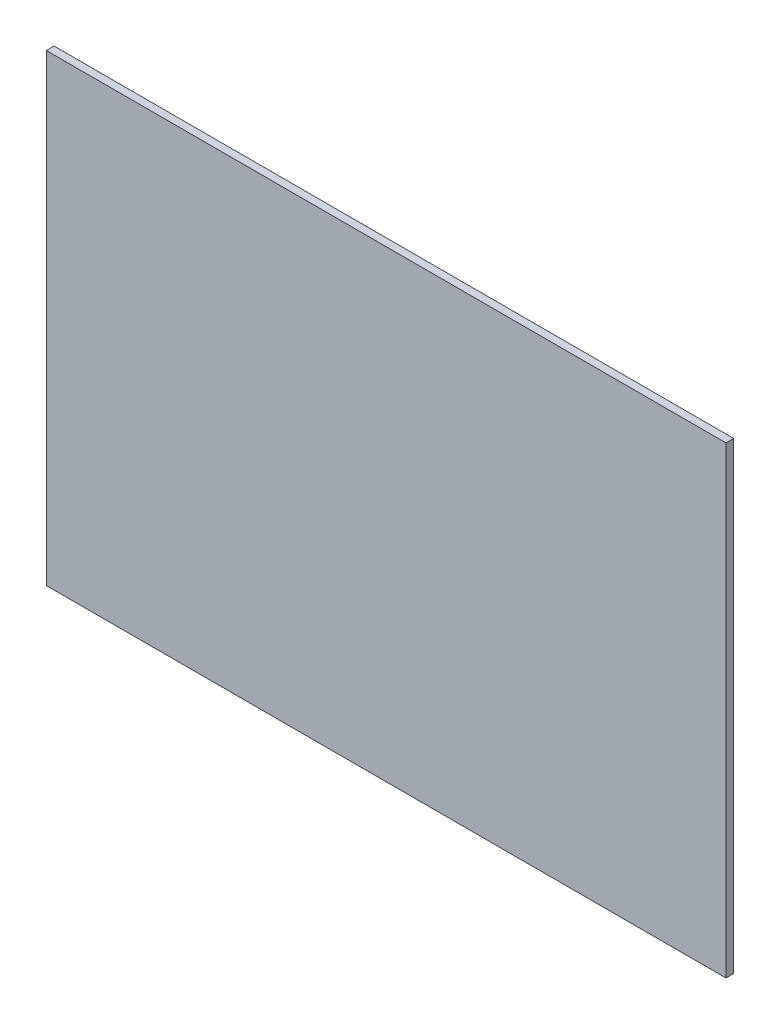
ISO-10303-21;
HEADER;
FILE_DESCRIPTION(('STEP AP214'),'2;1');
FILE_NAME('part.step','',(''),(''),'','','');
FILE_SCHEMA(('AUTOMOTIVE_DESIGN { 1 0 10303 214 1 1 1 1 }'));
ENDSEC;
DATA;
#1=APPLICATION_CONTEXT('core data for automotive mechanical design processes');
#2=APPLICATION_PROTOCOL_DEFINITION('international standard','automotive_design',2000,#1);
#3=PRODUCT_CONTEXT('',#1,'mechanical');
#4=PRODUCT('Part','Part','',(#3));
#5=PRODUCT_RELATED_PRODUCT_CATEGORY('part','',(#4));
#6=PRODUCT_DEFINITION_FORMATION('','',#4);
#7=PRODUCT_DEFINITION_CONTEXT('part definition',#1,'design');
#8=PRODUCT_DEFINITION('design','',#6,#7);
#9=PRODUCT_DEFINITION_SHAPE('','',#8);
#10=(LENGTH_UNIT() NAMED_UNIT(*) SI_UNIT(.MILLI.,.METRE.));
#11=(NAMED_UNIT(*) PLANE_ANGLE_UNIT() SI_UNIT($,.RADIAN.));
#12=(NAMED_UNIT(*) SI_UNIT($,.STERADIAN.) SOLID_ANGLE_UNIT());
#13=UNCERTAINTY_MEASURE_WITH_UNIT(LENGTH_MEASURE(1.E-05),#10,'distance_accuracy_value','');
#14=(GEOMETRIC_REPRESENTATION_CONTEXT(3) GLOBAL_UNCERTAINTY_ASSIGNED_CONTEXT((#13)) GLOBAL_UNIT_ASSIGNED_CONTEXT((#10,
#11,#12)) REPRESENTATION_CONTEXT('',''));
#15=CARTESIAN_POINT('',(0.,0.,0.));
#16=DIRECTION('',(0.,0.,1.));
#17=DIRECTION('',(1.,0.,0.));
#18=AXIS2_PLACEMENT_3D('',#15,#16,#17);
#19=CARTESIAN_POINT('',(0.,0.,0.));
#20=DIRECTION('',(0.,0.,1.));
#21=DIRECTION('',(1.,0.,0.));
#22=AXIS2_PLACEMENT_3D('',#19,#20,#21);
#23=PLANE('',#22);
#24=DIRECTION('',(0.,1.,0.));
#25=VECTOR('',#24,1.);
#26=CARTESIAN_POINT('',(0.,381.,0.));
#27=LINE('',#26,#25);
#28=CARTESIAN_POINT('',(0.,381.,0.));
#29=VERTEX_POINT('',#28);
#30=CARTESIAN_POINT('',(0.,0.,0.));
#31=VERTEX_POINT('',#30);
#32=EDGE_CURVE('E95',#29,#31,#27,.F.);
#33=ORIENTED_EDGE('',*,*,#32,.F.);
#34=DIRECTION('',(1.,0.,0.));
#35=VECTOR('',#34,1.);
#36=CARTESIAN_POINT('',(558.8,381.,0.));
#37=LINE('',#36,#35);
#38=CARTESIAN_POINT('',(558.8,381.,0.));
#39=VERTEX_POINT('',#38);
#40=EDGE_CURVE('E71',#39,#29,#37,.F.);
#41=ORIENTED_EDGE('',*,*,#40,.F.);
#42=DIRECTION('',(0.,1.,0.));
#43=VECTOR('',#42,1.);
#44=CARTESIAN_POINT('',(558.8,0.,0.));
#45=LINE('',#44,#43);
#46=CARTESIAN_POINT('',(558.8,0.,0.));
#47=VERTEX_POINT('',#46);
#48=EDGE_CURVE('E73',#47,#39,#45,.T.);
#49=ORIENTED_EDGE('',*,*,#48,.F.);
#50=DIRECTION('',(1.,0.,0.));
#51=VECTOR('',#50,1.);
#52=CARTESIAN_POINT('',(0.,0.,0.));
#53=LINE('',#52,#51);
#54=EDGE_CURVE('E36',#31,#47,#53,.T.);
#55=ORIENTED_EDGE('',*,*,#54,.F.);
#56=EDGE_LOOP('',(#33,#41,#49,#55));
#57=FACE_BOUND('',#56,.T.);
#58=ADVANCED_FACE('F33',(#57),#23,.F.);
#59=CARTESIAN_POINT('',(0.,0.,0.));
#60=DIRECTION('',(0.,-1.,0.));
#61=DIRECTION('',(0.,0.,-1.));
#62=AXIS2_PLACEMENT_3D('',#59,#60,#61);
#63=PLANE('',#62);
#64=DIRECTION('',(1.,0.,0.));
#65=VECTOR('',#64,1.);
#66=CARTESIAN_POINT('',(0.,0.,6.35));
#67=LINE('',#66,#65);
#68=CARTESIAN_POINT('',(0.,0.,6.35));
#69=VERTEX_POINT('',#68);
#70=CARTESIAN_POINT('',(558.8,0.,6.35));
#71=VERTEX_POINT('',#70);
#72=EDGE_CURVE('E99',#69,#71,#67,.T.);
#73=ORIENTED_EDGE('',*,*,#72,.F.);
#74=DIRECTION('',(0.,0.,1.));
#75=VECTOR('',#74,1.);
#76=CARTESIAN_POINT('',(0.,0.,0.));
#77=LINE('',#76,#75);
#78=EDGE_CURVE('E84',#31,#69,#77,.T.);
#79=ORIENTED_EDGE('',*,*,#78,.F.);
#80=ORIENTED_EDGE('',*,*,#54,.T.);
#81=DIRECTION('',(0.,0.,-1.));
#82=VECTOR('',#81,1.);
#83=CARTESIAN_POINT('',(558.8,0.,0.));
#84=LINE('',#83,#82);
#85=EDGE_CURVE('E79',#71,#47,#84,.T.);
#86=ORIENTED_EDGE('',*,*,#85,.F.);
#87=EDGE_LOOP('',(#73,#79,#80,#86));
#88=FACE_BOUND('',#87,.T.);
#89=ADVANCED_FACE('F81',(#88),#63,.T.);
#90=CARTESIAN_POINT('',(558.8,0.,0.));
#91=DIRECTION('',(1.,0.,0.));
#92=DIRECTION('',(0.,0.,-1.));
#93=AXIS2_PLACEMENT_3D('',#90,#91,#92);
#94=PLANE('',#93);
#95=DIRECTION('',(0.,1.,0.));
#96=VECTOR('',#95,1.);
#97=CARTESIAN_POINT('',(558.8,0.,6.35));
#98=LINE('',#97,#96);
#99=CARTESIAN_POINT('',(558.8,381.,6.35));
#100=VERTEX_POINT('',#99);
#101=EDGE_CURVE('E88',#71,#100,#98,.T.);
#102=ORIENTED_EDGE('',*,*,#101,.F.);
#103=ORIENTED_EDGE('',*,*,#85,.T.);
#104=ORIENTED_EDGE('',*,*,#48,.T.);
#105=DIRECTION('',(0.,0.,1.));
#106=VECTOR('',#105,1.);
#107=CARTESIAN_POINT('',(558.8,381.,0.));
#108=LINE('',#107,#106);
#109=EDGE_CURVE('E91',#100,#39,#108,.F.);
#110=ORIENTED_EDGE('',*,*,#109,.F.);
#111=EDGE_LOOP('',(#102,#103,#104,#110));
#112=FACE_BOUND('',#111,.T.);
#113=ADVANCED_FACE('F86',(#112),#94,.T.);
#114=CARTESIAN_POINT('',(558.8,381.,0.));
#115=DIRECTION('',(0.,1.,0.));
#116=DIRECTION('',(0.,0.,1.));
#117=AXIS2_PLACEMENT_3D('',#114,#115,#116);
#118=PLANE('',#117);
#119=DIRECTION('',(1.,0.,0.));
#120=VECTOR('',#119,1.);
#121=CARTESIAN_POINT('',(0.,381.,6.35));
#122=LINE('',#121,#120);
#123=CARTESIAN_POINT('',(0.,381.,6.35));
#124=VERTEX_POINT('',#123);
#125=EDGE_CURVE('E42',#100,#124,#122,.F.);
#126=ORIENTED_EDGE('',*,*,#125,.F.);
#127=ORIENTED_EDGE('',*,*,#109,.T.);
#128=ORIENTED_EDGE('',*,*,#40,.T.);
#129=DIRECTION('',(0.,0.,1.));
#130=VECTOR('',#129,1.);
#131=CARTESIAN_POINT('',(0.,381.,0.));
#132=LINE('',#131,#130);
#133=EDGE_CURVE('E51',#124,#29,#132,.F.);
#134=ORIENTED_EDGE('',*,*,#133,.F.);
#135=EDGE_LOOP('',(#126,#127,#128,#134));
#136=FACE_BOUND('',#135,.T.);
#137=ADVANCED_FACE('F105',(#136),#118,.T.);
#138=CARTESIAN_POINT('',(0.,381.,0.));
#139=DIRECTION('',(-1.,0.,0.));
#140=DIRECTION('',(0.,0.,1.));
#141=AXIS2_PLACEMENT_3D('',#138,#139,#140);
#142=PLANE('',#141);
#143=DIRECTION('',(0.,1.,0.));
#144=VECTOR('',#143,1.);
#145=CARTESIAN_POINT('',(0.,0.,6.35));
#146=LINE('',#145,#144);
#147=EDGE_CURVE('E11',#124,#69,#146,.F.);
#148=ORIENTED_EDGE('',*,*,#147,.F.);
#149=ORIENTED_EDGE('',*,*,#133,.T.);
#150=ORIENTED_EDGE('',*,*,#32,.T.);
#151=ORIENTED_EDGE('',*,*,#78,.T.);
#152=EDGE_LOOP('',(#148,#149,#150,#151));
#153=FACE_BOUND('',#152,.T.);
#154=ADVANCED_FACE('F107',(#153),#142,.T.);
#155=CARTESIAN_POINT('',(0.,0.,6.35));
#156=DIRECTION('',(0.,0.,1.));
#157=DIRECTION('',(1.,0.,0.));
#158=AXIS2_PLACEMENT_3D('',#155,#156,#157);
#159=PLANE('',#158);
#160=ORIENTED_EDGE('',*,*,#125,.T.);
#161=ORIENTED_EDGE('',*,*,#147,.T.);
#162=ORIENTED_EDGE('',*,*,#72,.T.);
#163=ORIENTED_EDGE('',*,*,#101,.T.);
#164=EDGE_LOOP('',(#160,#161,#162,#163));
#165=FACE_BOUND('',#164,.T.);
#166=ADVANCED_FACE('F104',(#165),#159,.T.);
#167=CLOSED_SHELL('',(#58,#89,#113,#137,#154,#166));
#168=MANIFOLD_SOLID_BREP('B2',#167);
#169=ADVANCED_BREP_SHAPE_REPRESENTATION('',(#18,#168),#14);
#170=SHAPE_DEFINITION_REPRESENTATION(#9,#169);
ENDSEC;
END-ISO-10303-21;
